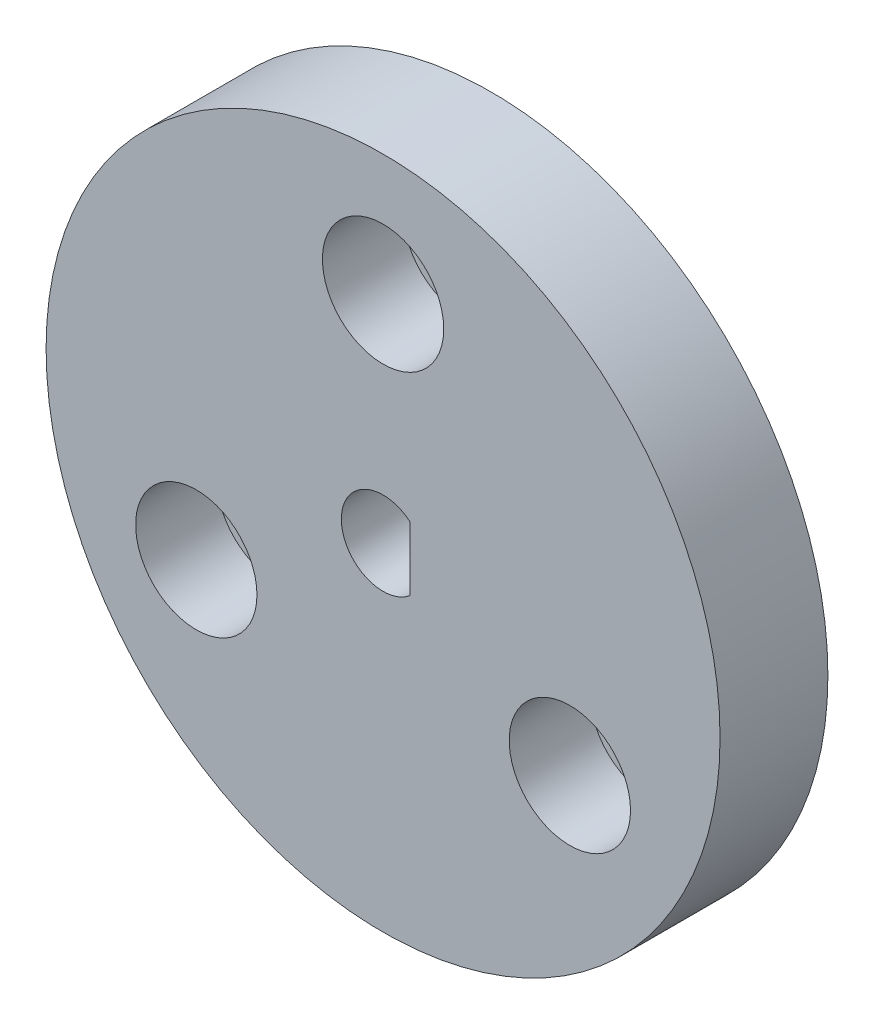
ISO-10303-21;
HEADER;
FILE_DESCRIPTION(('STEP AP214'),'2;1');
FILE_NAME('part.step','',(''),(''),'','','');
FILE_SCHEMA(('AUTOMOTIVE_DESIGN { 1 0 10303 214 1 1 1 1 }'));
ENDSEC;
DATA;
#1=APPLICATION_CONTEXT('core data for automotive mechanical design processes');
#2=APPLICATION_PROTOCOL_DEFINITION('international standard','automotive_design',2000,#1);
#3=PRODUCT_CONTEXT('',#1,'mechanical');
#4=PRODUCT('Part','Part','',(#3));
#5=PRODUCT_RELATED_PRODUCT_CATEGORY('part','',(#4));
#6=PRODUCT_DEFINITION_FORMATION('','',#4);
#7=PRODUCT_DEFINITION_CONTEXT('part definition',#1,'design');
#8=PRODUCT_DEFINITION('design','',#6,#7);
#9=PRODUCT_DEFINITION_SHAPE('','',#8);
#10=(LENGTH_UNIT() NAMED_UNIT(*) SI_UNIT(.MILLI.,.METRE.));
#11=(NAMED_UNIT(*) PLANE_ANGLE_UNIT() SI_UNIT($,.RADIAN.));
#12=(NAMED_UNIT(*) SI_UNIT($,.STERADIAN.) SOLID_ANGLE_UNIT());
#13=UNCERTAINTY_MEASURE_WITH_UNIT(LENGTH_MEASURE(1.E-05),#10,'distance_accuracy_value','');
#14=(GEOMETRIC_REPRESENTATION_CONTEXT(3) GLOBAL_UNCERTAINTY_ASSIGNED_CONTEXT((#13)) GLOBAL_UNIT_ASSIGNED_CONTEXT((#10,
#11,#12)) REPRESENTATION_CONTEXT('',''));
#15=CARTESIAN_POINT('',(0.,0.,0.));
#16=DIRECTION('',(0.,0.,1.));
#17=DIRECTION('',(1.,0.,0.));
#18=AXIS2_PLACEMENT_3D('',#15,#16,#17);
#19=CARTESIAN_POINT('',(-6.92820323027551,-4.,4.));
#20=DIRECTION('',(0.,0.,-1.));
#21=DIRECTION('',(-1.,0.,0.));
#22=AXIS2_PLACEMENT_3D('',#19,#20,#21);
#23=CYLINDRICAL_SURFACE('',#22,1.5);
#24=CARTESIAN_POINT('',(-6.92820323027551,-4.,0.));
#25=DIRECTION('',(0.,0.,1.));
#26=DIRECTION('',(1.,0.,0.));
#27=AXIS2_PLACEMENT_3D('',#24,#25,#26);
#28=CIRCLE('',#27,1.5);
#29=CARTESIAN_POINT('',(-5.42820323027551,-4.,0.));
#30=VERTEX_POINT('',#29);
#31=EDGE_CURVE('E140',#30,#30,#28,.T.);
#32=ORIENTED_EDGE('',*,*,#31,.F.);
#33=EDGE_LOOP('',(#32));
#34=FACE_BOUND('',#33,.T.);
#35=CARTESIAN_POINT('',(-6.92820323027551,-4.,1.));
#36=DIRECTION('',(0.,0.,1.));
#37=DIRECTION('',(1.,0.,0.));
#38=AXIS2_PLACEMENT_3D('',#35,#36,#37);
#39=CIRCLE('',#38,1.5);
#40=CARTESIAN_POINT('',(-5.42820323027551,-4.,1.));
#41=VERTEX_POINT('',#40);
#42=EDGE_CURVE('E71',#41,#41,#39,.T.);
#43=ORIENTED_EDGE('',*,*,#42,.T.);
#44=EDGE_LOOP('',(#43));
#45=FACE_BOUND('',#44,.T.);
#46=ADVANCED_FACE('F67',(#34,#45),#23,.F.);
#47=CARTESIAN_POINT('',(6.92820323027551,-4.,4.));
#48=DIRECTION('',(0.,0.,-1.));
#49=DIRECTION('',(-1.,0.,0.));
#50=AXIS2_PLACEMENT_3D('',#47,#48,#49);
#51=CYLINDRICAL_SURFACE('',#50,1.5);
#52=CARTESIAN_POINT('',(6.92820323027551,-4.,0.));
#53=DIRECTION('',(0.,0.,1.));
#54=DIRECTION('',(1.,0.,0.));
#55=AXIS2_PLACEMENT_3D('',#52,#53,#54);
#56=CIRCLE('',#55,1.5);
#57=CARTESIAN_POINT('',(8.42820323027551,-4.,0.));
#58=VERTEX_POINT('',#57);
#59=EDGE_CURVE('E137',#58,#58,#56,.T.);
#60=ORIENTED_EDGE('',*,*,#59,.F.);
#61=EDGE_LOOP('',(#60));
#62=FACE_BOUND('',#61,.T.);
#63=CARTESIAN_POINT('',(6.92820323027551,-4.,1.));
#64=DIRECTION('',(0.,0.,1.));
#65=DIRECTION('',(1.,0.,0.));
#66=AXIS2_PLACEMENT_3D('',#63,#64,#65);
#67=CIRCLE('',#66,1.5);
#68=CARTESIAN_POINT('',(8.42820323027551,-4.,1.));
#69=VERTEX_POINT('',#68);
#70=EDGE_CURVE('E146',#69,#69,#67,.T.);
#71=ORIENTED_EDGE('',*,*,#70,.T.);
#72=EDGE_LOOP('',(#71));
#73=FACE_BOUND('',#72,.T.);
#74=ADVANCED_FACE('F189',(#62,#73),#51,.F.);
#75=CARTESIAN_POINT('',(0.,8.,4.));
#76=DIRECTION('',(0.,0.,-1.));
#77=DIRECTION('',(-1.,0.,0.));
#78=AXIS2_PLACEMENT_3D('',#75,#76,#77);
#79=CYLINDRICAL_SURFACE('',#78,1.5);
#80=CARTESIAN_POINT('',(0.,8.,0.));
#81=DIRECTION('',(0.,0.,1.));
#82=DIRECTION('',(1.,0.,0.));
#83=AXIS2_PLACEMENT_3D('',#80,#81,#82);
#84=CIRCLE('',#83,1.5);
#85=CARTESIAN_POINT('',(1.5,8.,0.));
#86=VERTEX_POINT('',#85);
#87=EDGE_CURVE('E134',#86,#86,#84,.T.);
#88=ORIENTED_EDGE('',*,*,#87,.F.);
#89=EDGE_LOOP('',(#88));
#90=FACE_BOUND('',#89,.T.);
#91=CARTESIAN_POINT('',(0.,8.,1.));
#92=DIRECTION('',(0.,0.,1.));
#93=DIRECTION('',(1.,0.,0.));
#94=AXIS2_PLACEMENT_3D('',#91,#92,#93);
#95=CIRCLE('',#94,1.5);
#96=CARTESIAN_POINT('',(1.5,8.,1.));
#97=VERTEX_POINT('',#96);
#98=EDGE_CURVE('E123',#97,#97,#95,.T.);
#99=ORIENTED_EDGE('',*,*,#98,.T.);
#100=EDGE_LOOP('',(#99));
#101=FACE_BOUND('',#100,.T.);
#102=ADVANCED_FACE('F179',(#90,#101),#79,.F.);
#103=CARTESIAN_POINT('',(0.,0.,0.));
#104=DIRECTION('',(0.,0.,1.));
#105=DIRECTION('',(1.,0.,0.));
#106=AXIS2_PLACEMENT_3D('',#103,#104,#105);
#107=PLANE('',#106);
#108=CARTESIAN_POINT('',(0.,0.,0.));
#109=DIRECTION('',(0.,0.,1.));
#110=DIRECTION('',(1.,0.,0.));
#111=AXIS2_PLACEMENT_3D('',#108,#109,#110);
#112=CIRCLE('',#111,1.55);
#113=CARTESIAN_POINT('',(1.00000000000004,1.18427192823264,0.));
#114=VERTEX_POINT('',#113);
#115=CARTESIAN_POINT('',(0.999999999999995,-1.18427192823271,0.));
#116=VERTEX_POINT('',#115);
#117=EDGE_CURVE('E112',#114,#116,#112,.T.);
#118=ORIENTED_EDGE('',*,*,#117,.T.);
#119=DIRECTION('',(0.,1.,0.));
#120=VECTOR('',#119,1.);
#121=CARTESIAN_POINT('',(1.,0.,0.));
#122=LINE('',#121,#120);
#123=EDGE_CURVE('E84',#116,#114,#122,.T.);
#124=ORIENTED_EDGE('',*,*,#123,.T.);
#125=EDGE_LOOP('',(#118,#124));
#126=FACE_BOUND('',#125,.T.);
#127=CARTESIAN_POINT('',(0.,0.,0.));
#128=DIRECTION('',(0.,0.,1.));
#129=DIRECTION('',(1.,0.,0.));
#130=AXIS2_PLACEMENT_3D('',#127,#128,#129);
#131=CIRCLE('',#130,12.5);
#132=CARTESIAN_POINT('',(12.5,0.,0.));
#133=VERTEX_POINT('',#132);
#134=EDGE_CURVE('E76',#133,#133,#131,.T.);
#135=ORIENTED_EDGE('',*,*,#134,.F.);
#136=EDGE_LOOP('',(#135));
#137=FACE_BOUND('',#136,.T.);
#138=ORIENTED_EDGE('',*,*,#31,.T.);
#139=EDGE_LOOP('',(#138));
#140=FACE_BOUND('',#139,.T.);
#141=ORIENTED_EDGE('',*,*,#59,.T.);
#142=EDGE_LOOP('',(#141));
#143=FACE_BOUND('',#142,.T.);
#144=ORIENTED_EDGE('',*,*,#87,.T.);
#145=EDGE_LOOP('',(#144));
#146=FACE_BOUND('',#145,.T.);
#147=ADVANCED_FACE('F69',(#126,#137,#140,#143,#146),#107,.F.);
#148=CARTESIAN_POINT('',(0.,0.,4.));
#149=DIRECTION('',(0.,0.,-1.));
#150=DIRECTION('',(-1.,0.,0.));
#151=AXIS2_PLACEMENT_3D('',#148,#149,#150);
#152=CYLINDRICAL_SURFACE('',#151,12.5);
#153=CARTESIAN_POINT('',(0.,0.,4.));
#154=DIRECTION('',(0.,0.,1.));
#155=DIRECTION('',(1.,0.,0.));
#156=AXIS2_PLACEMENT_3D('',#153,#154,#155);
#157=CIRCLE('',#156,12.5);
#158=CARTESIAN_POINT('',(12.5,0.,4.));
#159=VERTEX_POINT('',#158);
#160=EDGE_CURVE('E13',#159,#159,#157,.T.);
#161=ORIENTED_EDGE('',*,*,#160,.F.);
#162=EDGE_LOOP('',(#161));
#163=FACE_BOUND('',#162,.T.);
#164=ORIENTED_EDGE('',*,*,#134,.T.);
#165=EDGE_LOOP('',(#164));
#166=FACE_BOUND('',#165,.T.);
#167=ADVANCED_FACE('F169',(#163,#166),#152,.T.);
#168=CARTESIAN_POINT('',(0.,0.,4.));
#169=DIRECTION('',(0.,0.,1.));
#170=DIRECTION('',(1.,0.,0.));
#171=AXIS2_PLACEMENT_3D('',#168,#169,#170);
#172=PLANE('',#171);
#173=DIRECTION('',(0.,1.,0.));
#174=VECTOR('',#173,1.);
#175=CARTESIAN_POINT('',(1.,0.,4.));
#176=LINE('',#175,#174);
#177=CARTESIAN_POINT('',(1.,-1.18427192823271,4.));
#178=VERTEX_POINT('',#177);
#179=CARTESIAN_POINT('',(1.00000000000005,1.18427192823266,4.));
#180=VERTEX_POINT('',#179);
#181=EDGE_CURVE('E89',#178,#180,#176,.T.);
#182=ORIENTED_EDGE('',*,*,#181,.F.);
#183=CARTESIAN_POINT('',(0.,0.,4.));
#184=DIRECTION('',(0.,0.,1.));
#185=DIRECTION('',(1.,0.,0.));
#186=AXIS2_PLACEMENT_3D('',#183,#184,#185);
#187=CIRCLE('',#186,1.55);
#188=EDGE_CURVE('E104',#180,#178,#187,.T.);
#189=ORIENTED_EDGE('',*,*,#188,.F.);
#190=EDGE_LOOP('',(#182,#189));
#191=FACE_BOUND('',#190,.T.);
#192=CARTESIAN_POINT('',(0.,8.,4.));
#193=DIRECTION('',(0.,0.,1.));
#194=DIRECTION('',(1.,0.,0.));
#195=AXIS2_PLACEMENT_3D('',#192,#193,#194);
#196=CIRCLE('',#195,2.25);
#197=CARTESIAN_POINT('',(2.25,8.,4.));
#198=VERTEX_POINT('',#197);
#199=EDGE_CURVE('E116',#198,#198,#196,.T.);
#200=ORIENTED_EDGE('',*,*,#199,.F.);
#201=EDGE_LOOP('',(#200));
#202=FACE_BOUND('',#201,.T.);
#203=CARTESIAN_POINT('',(6.92820323027551,-4.,4.));
#204=DIRECTION('',(0.,0.,1.));
#205=DIRECTION('',(1.,0.,0.));
#206=AXIS2_PLACEMENT_3D('',#203,#204,#205);
#207=CIRCLE('',#206,2.25);
#208=CARTESIAN_POINT('',(9.17820323027551,-4.,4.));
#209=VERTEX_POINT('',#208);
#210=EDGE_CURVE('E120',#209,#209,#207,.T.);
#211=ORIENTED_EDGE('',*,*,#210,.F.);
#212=EDGE_LOOP('',(#211));
#213=FACE_BOUND('',#212,.T.);
#214=CARTESIAN_POINT('',(-6.92820323027551,-4.,4.));
#215=DIRECTION('',(0.,0.,1.));
#216=DIRECTION('',(1.,0.,0.));
#217=AXIS2_PLACEMENT_3D('',#214,#215,#216);
#218=CIRCLE('',#217,2.25);
#219=CARTESIAN_POINT('',(-4.67820323027551,-4.,4.));
#220=VERTEX_POINT('',#219);
#221=EDGE_CURVE('E127',#220,#220,#218,.T.);
#222=ORIENTED_EDGE('',*,*,#221,.F.);
#223=EDGE_LOOP('',(#222));
#224=FACE_BOUND('',#223,.T.);
#225=ORIENTED_EDGE('',*,*,#160,.T.);
#226=EDGE_LOOP('',(#225));
#227=FACE_BOUND('',#226,.T.);
#228=ADVANCED_FACE('F108',(#191,#202,#213,#224,#227),#172,.T.);
#229=CARTESIAN_POINT('',(-6.92820323027551,-4.,-6.36396103067893));
#230=DIRECTION('',(0.,0.,1.));
#231=DIRECTION('',(1.,0.,0.));
#232=AXIS2_PLACEMENT_3D('',#229,#230,#231);
#233=CYLINDRICAL_SURFACE('',#232,2.25);
#234=CARTESIAN_POINT('',(-6.92820323027551,-4.,1.));
#235=DIRECTION('',(0.,0.,1.));
#236=DIRECTION('',(1.,0.,0.));
#237=AXIS2_PLACEMENT_3D('',#234,#235,#236);
#238=CIRCLE('',#237,2.25);
#239=CARTESIAN_POINT('',(-4.67820323027551,-4.,1.));
#240=VERTEX_POINT('',#239);
#241=EDGE_CURVE('E100',#240,#240,#238,.F.);
#242=CARTESIAN_POINT('',(-4.67820323027551,-4.,1.));
#243=CARTESIAN_POINT('',(-4.67820323027551,-4.,1.03125));
#244=CARTESIAN_POINT('',(-4.67820323027551,-4.,1.0625));
#245=CARTESIAN_POINT('',(-4.67820323027551,-4.,1.125));
#246=CARTESIAN_POINT('',(-4.67820323027551,-4.,1.15625));
#247=CARTESIAN_POINT('',(-4.67820323027551,-4.,1.21875));
#248=CARTESIAN_POINT('',(-4.67820323027551,-4.,1.25));
#249=CARTESIAN_POINT('',(-4.67820323027551,-4.,1.3125));
#250=CARTESIAN_POINT('',(-4.67820323027551,-4.,1.34375));
#251=CARTESIAN_POINT('',(-4.67820323027551,-4.,1.40625));
#252=CARTESIAN_POINT('',(-4.67820323027551,-4.,1.4375));
#253=CARTESIAN_POINT('',(-4.67820323027551,-4.,1.5));
#254=CARTESIAN_POINT('',(-4.67820323027551,-4.,1.53125));
#255=CARTESIAN_POINT('',(-4.67820323027551,-4.,1.59375));
#256=CARTESIAN_POINT('',(-4.67820323027551,-4.,1.625));
#257=CARTESIAN_POINT('',(-4.67820323027551,-4.,1.6875));
#258=CARTESIAN_POINT('',(-4.67820323027551,-4.,1.71875));
#259=CARTESIAN_POINT('',(-4.67820323027551,-4.,1.78125));
#260=CARTESIAN_POINT('',(-4.67820323027551,-4.,1.8125));
#261=CARTESIAN_POINT('',(-4.67820323027551,-4.,1.875));
#262=CARTESIAN_POINT('',(-4.67820323027551,-4.,1.90625));
#263=CARTESIAN_POINT('',(-4.67820323027551,-4.,1.96875));
#264=CARTESIAN_POINT('',(-4.67820323027551,-4.,2.));
#265=CARTESIAN_POINT('',(-4.67820323027551,-4.,2.0625));
#266=CARTESIAN_POINT('',(-4.67820323027551,-4.,2.09375));
#267=CARTESIAN_POINT('',(-4.67820323027551,-4.,2.15625));
#268=CARTESIAN_POINT('',(-4.67820323027551,-4.,2.1875));
#269=CARTESIAN_POINT('',(-4.67820323027551,-4.,2.25));
#270=CARTESIAN_POINT('',(-4.67820323027551,-4.,2.28125));
#271=CARTESIAN_POINT('',(-4.67820323027551,-4.,2.34375));
#272=CARTESIAN_POINT('',(-4.67820323027551,-4.,2.375));
#273=CARTESIAN_POINT('',(-4.67820323027551,-4.,2.4375));
#274=CARTESIAN_POINT('',(-4.67820323027551,-4.,2.46875));
#275=CARTESIAN_POINT('',(-4.67820323027551,-4.,2.53125));
#276=CARTESIAN_POINT('',(-4.67820323027551,-4.,2.5625));
#277=CARTESIAN_POINT('',(-4.67820323027551,-4.,2.625));
#278=CARTESIAN_POINT('',(-4.67820323027551,-4.,2.65625));
#279=CARTESIAN_POINT('',(-4.67820323027551,-4.,2.71875));
#280=CARTESIAN_POINT('',(-4.67820323027551,-4.,2.75));
#281=CARTESIAN_POINT('',(-4.67820323027551,-4.,2.8125));
#282=CARTESIAN_POINT('',(-4.67820323027551,-4.,2.84375));
#283=CARTESIAN_POINT('',(-4.67820323027551,-4.,2.90625));
#284=CARTESIAN_POINT('',(-4.67820323027551,-4.,2.9375));
#285=CARTESIAN_POINT('',(-4.67820323027551,-4.,3.));
#286=CARTESIAN_POINT('',(-4.67820323027551,-4.,3.03125));
#287=CARTESIAN_POINT('',(-4.67820323027551,-4.,3.09375));
#288=CARTESIAN_POINT('',(-4.67820323027551,-4.,3.125));
#289=CARTESIAN_POINT('',(-4.67820323027551,-4.,3.1875));
#290=CARTESIAN_POINT('',(-4.67820323027551,-4.,3.21875));
#291=CARTESIAN_POINT('',(-4.67820323027551,-4.,3.28125));
#292=CARTESIAN_POINT('',(-4.67820323027551,-4.,3.3125));
#293=CARTESIAN_POINT('',(-4.67820323027551,-4.,3.375));
#294=CARTESIAN_POINT('',(-4.67820323027551,-4.,3.40625));
#295=CARTESIAN_POINT('',(-4.67820323027551,-4.,3.46875));
#296=CARTESIAN_POINT('',(-4.67820323027551,-4.,3.5));
#297=CARTESIAN_POINT('',(-4.67820323027551,-4.,3.5625));
#298=CARTESIAN_POINT('',(-4.67820323027551,-4.,3.59375));
#299=CARTESIAN_POINT('',(-4.67820323027551,-4.,3.65625));
#300=CARTESIAN_POINT('',(-4.67820323027551,-4.,3.6875));
#301=CARTESIAN_POINT('',(-4.67820323027551,-4.,3.75));
#302=CARTESIAN_POINT('',(-4.67820323027551,-4.,3.78125));
#303=CARTESIAN_POINT('',(-4.67820323027551,-4.,3.84375));
#304=CARTESIAN_POINT('',(-4.67820323027551,-4.,3.875));
#305=CARTESIAN_POINT('',(-4.67820323027551,-4.,3.9375));
#306=CARTESIAN_POINT('',(-4.67820323027551,-4.,3.96875));
#307=CARTESIAN_POINT('',(-4.67820323027551,-4.,4.));
#308=B_SPLINE_CURVE_WITH_KNOTS('',3,(#242,#243,#244,#245,#246,#247,#248,#249,#250,#251,#252,
#253,#254,#255,#256,#257,#258,#259,#260,#261,#262,#263,#264,#265,#266,#267,#268,#269,#270,#271,
#272,#273,#274,#275,#276,#277,#278,#279,#280,#281,#282,#283,#284,#285,#286,#287,#288,#289,#290,
#291,#292,#293,#294,#295,#296,#297,#298,#299,#300,#301,#302,#303,#304,#305,#306,#307),
.UNSPECIFIED.,.F.,.F.,(4,2,2,2,2,2,2,2,2,2,2,2,2,2,2,2,2,2,2,2,2,2,2,2,2,2,2,2,2,2,2,2,4),(0.,
0.0937500000000001,0.1875,0.28125,0.375,0.46875,0.5625,0.65625,0.75,0.843749999999998,
0.937499999999998,1.03125,1.125,1.21875,1.3125,1.40625,1.5,1.59375,1.6875,1.78125,1.875,1.96875,
2.0625,2.15625,2.25,2.34375,2.4375,2.53125,2.625,2.71875,2.8125,2.90625,3.),.UNSPECIFIED.);
#309=EDGE_CURVE('BSEAM158',#240,#220,#308,.T.);
#310=ORIENTED_EDGE('',*,*,#241,.T.);
#311=ORIENTED_EDGE('',*,*,#221,.T.);
#312=ORIENTED_EDGE('',*,*,#309,.T.);
#313=ORIENTED_EDGE('',*,*,#309,.F.);
#314=EDGE_LOOP('',(#310,#312,#311,#313));
#315=FACE_BOUND('',#314,.T.);
#316=ADVANCED_FACE('F158',(#315),#233,.F.);
#317=CARTESIAN_POINT('',(0.,0.,1.));
#318=DIRECTION('',(0.,0.,1.));
#319=DIRECTION('',(1.,0.,0.));
#320=AXIS2_PLACEMENT_3D('',#317,#318,#319);
#321=PLANE('',#320);
#322=ORIENTED_EDGE('',*,*,#42,.F.);
#323=EDGE_LOOP('',(#322));
#324=FACE_BOUND('',#323,.T.);
#325=ORIENTED_EDGE('',*,*,#241,.F.);
#326=EDGE_LOOP('',(#325));
#327=FACE_BOUND('',#326,.T.);
#328=ADVANCED_FACE('F154',(#324,#327),#321,.T.);
#329=CARTESIAN_POINT('',(6.92820323027551,-4.,-6.36396103067893));
#330=DIRECTION('',(0.,0.,1.));
#331=DIRECTION('',(1.,0.,0.));
#332=AXIS2_PLACEMENT_3D('',#329,#330,#331);
#333=CYLINDRICAL_SURFACE('',#332,2.25);
#334=CARTESIAN_POINT('',(6.92820323027551,-4.,1.));
#335=DIRECTION('',(0.,0.,1.));
#336=DIRECTION('',(1.,0.,0.));
#337=AXIS2_PLACEMENT_3D('',#334,#335,#336);
#338=CIRCLE('',#337,2.25);
#339=CARTESIAN_POINT('',(9.17820323027551,-4.,1.));
#340=VERTEX_POINT('',#339);
#341=EDGE_CURVE('E124',#340,#340,#338,.F.);
#342=CARTESIAN_POINT('',(9.17820323027551,-4.,1.));
#343=CARTESIAN_POINT('',(9.17820323027551,-4.,1.03125));
#344=CARTESIAN_POINT('',(9.17820323027551,-4.,1.0625));
#345=CARTESIAN_POINT('',(9.17820323027551,-4.,1.125));
#346=CARTESIAN_POINT('',(9.17820323027551,-4.,1.15625));
#347=CARTESIAN_POINT('',(9.17820323027551,-4.,1.21875));
#348=CARTESIAN_POINT('',(9.17820323027551,-4.,1.25));
#349=CARTESIAN_POINT('',(9.17820323027551,-4.,1.3125));
#350=CARTESIAN_POINT('',(9.17820323027551,-4.,1.34375));
#351=CARTESIAN_POINT('',(9.17820323027551,-4.,1.40625));
#352=CARTESIAN_POINT('',(9.17820323027551,-4.,1.4375));
#353=CARTESIAN_POINT('',(9.17820323027551,-4.,1.5));
#354=CARTESIAN_POINT('',(9.17820323027551,-4.,1.53125));
#355=CARTESIAN_POINT('',(9.17820323027551,-4.,1.59375));
#356=CARTESIAN_POINT('',(9.17820323027551,-4.,1.625));
#357=CARTESIAN_POINT('',(9.17820323027551,-4.,1.6875));
#358=CARTESIAN_POINT('',(9.17820323027551,-4.,1.71875));
#359=CARTESIAN_POINT('',(9.17820323027551,-4.,1.78125));
#360=CARTESIAN_POINT('',(9.17820323027551,-4.,1.8125));
#361=CARTESIAN_POINT('',(9.17820323027551,-4.,1.875));
#362=CARTESIAN_POINT('',(9.17820323027551,-4.,1.90625));
#363=CARTESIAN_POINT('',(9.17820323027551,-4.,1.96875));
#364=CARTESIAN_POINT('',(9.17820323027551,-4.,2.));
#365=CARTESIAN_POINT('',(9.17820323027551,-4.,2.0625));
#366=CARTESIAN_POINT('',(9.17820323027551,-4.,2.09375));
#367=CARTESIAN_POINT('',(9.17820323027551,-4.,2.15625));
#368=CARTESIAN_POINT('',(9.17820323027551,-4.,2.1875));
#369=CARTESIAN_POINT('',(9.17820323027551,-4.,2.25));
#370=CARTESIAN_POINT('',(9.17820323027551,-4.,2.28125));
#371=CARTESIAN_POINT('',(9.17820323027551,-4.,2.34375));
#372=CARTESIAN_POINT('',(9.17820323027551,-4.,2.375));
#373=CARTESIAN_POINT('',(9.17820323027551,-4.,2.4375));
#374=CARTESIAN_POINT('',(9.17820323027551,-4.,2.46875));
#375=CARTESIAN_POINT('',(9.17820323027551,-4.,2.53125));
#376=CARTESIAN_POINT('',(9.17820323027551,-4.,2.5625));
#377=CARTESIAN_POINT('',(9.17820323027551,-4.,2.625));
#378=CARTESIAN_POINT('',(9.17820323027551,-4.,2.65625));
#379=CARTESIAN_POINT('',(9.17820323027551,-4.,2.71875));
#380=CARTESIAN_POINT('',(9.17820323027551,-4.,2.75));
#381=CARTESIAN_POINT('',(9.17820323027551,-4.,2.8125));
#382=CARTESIAN_POINT('',(9.17820323027551,-4.,2.84375));
#383=CARTESIAN_POINT('',(9.17820323027551,-4.,2.90625));
#384=CARTESIAN_POINT('',(9.17820323027551,-4.,2.9375));
#385=CARTESIAN_POINT('',(9.17820323027551,-4.,3.));
#386=CARTESIAN_POINT('',(9.17820323027551,-4.,3.03125));
#387=CARTESIAN_POINT('',(9.17820323027551,-4.,3.09375));
#388=CARTESIAN_POINT('',(9.17820323027551,-4.,3.125));
#389=CARTESIAN_POINT('',(9.17820323027551,-4.,3.1875));
#390=CARTESIAN_POINT('',(9.17820323027551,-4.,3.21875));
#391=CARTESIAN_POINT('',(9.17820323027551,-4.,3.28125));
#392=CARTESIAN_POINT('',(9.17820323027551,-4.,3.3125));
#393=CARTESIAN_POINT('',(9.17820323027551,-4.,3.375));
#394=CARTESIAN_POINT('',(9.17820323027551,-4.,3.40625));
#395=CARTESIAN_POINT('',(9.17820323027551,-4.,3.46875));
#396=CARTESIAN_POINT('',(9.17820323027551,-4.,3.5));
#397=CARTESIAN_POINT('',(9.17820323027551,-4.,3.5625));
#398=CARTESIAN_POINT('',(9.17820323027551,-4.,3.59375));
#399=CARTESIAN_POINT('',(9.17820323027551,-4.,3.65625));
#400=CARTESIAN_POINT('',(9.17820323027551,-4.,3.6875));
#401=CARTESIAN_POINT('',(9.17820323027551,-4.,3.75));
#402=CARTESIAN_POINT('',(9.17820323027551,-4.,3.78125));
#403=CARTESIAN_POINT('',(9.17820323027551,-4.,3.84375));
#404=CARTESIAN_POINT('',(9.17820323027551,-4.,3.875));
#405=CARTESIAN_POINT('',(9.17820323027551,-4.,3.9375));
#406=CARTESIAN_POINT('',(9.17820323027551,-4.,3.96875));
#407=CARTESIAN_POINT('',(9.17820323027551,-4.,4.));
#408=B_SPLINE_CURVE_WITH_KNOTS('',3,(#342,#343,#344,#345,#346,#347,#348,#349,#350,#351,#352,
#353,#354,#355,#356,#357,#358,#359,#360,#361,#362,#363,#364,#365,#366,#367,#368,#369,#370,#371,
#372,#373,#374,#375,#376,#377,#378,#379,#380,#381,#382,#383,#384,#385,#386,#387,#388,#389,#390,
#391,#392,#393,#394,#395,#396,#397,#398,#399,#400,#401,#402,#403,#404,#405,#406,#407),
.UNSPECIFIED.,.F.,.F.,(4,2,2,2,2,2,2,2,2,2,2,2,2,2,2,2,2,2,2,2,2,2,2,2,2,2,2,2,2,2,2,2,4),(0.,
0.0937500000000001,0.1875,0.28125,0.375,0.46875,0.5625,0.65625,0.75,0.843749999999998,
0.937499999999998,1.03125,1.125,1.21875,1.3125,1.40625,1.5,1.59375,1.6875,1.78125,1.875,1.96875,
2.0625,2.15625,2.25,2.34375,2.4375,2.53125,2.625,2.71875,2.8125,2.90625,3.),.UNSPECIFIED.);
#409=EDGE_CURVE('BSEAM157',#340,#209,#408,.T.);
#410=ORIENTED_EDGE('',*,*,#341,.T.);
#411=ORIENTED_EDGE('',*,*,#210,.T.);
#412=ORIENTED_EDGE('',*,*,#409,.T.);
#413=ORIENTED_EDGE('',*,*,#409,.F.);
#414=EDGE_LOOP('',(#410,#412,#411,#413));
#415=FACE_BOUND('',#414,.T.);
#416=ADVANCED_FACE('F157',(#415),#333,.F.);
#417=CARTESIAN_POINT('',(0.,0.,1.));
#418=DIRECTION('',(0.,0.,1.));
#419=DIRECTION('',(1.,0.,0.));
#420=AXIS2_PLACEMENT_3D('',#417,#418,#419);
#421=PLANE('',#420);
#422=ORIENTED_EDGE('',*,*,#70,.F.);
#423=EDGE_LOOP('',(#422));
#424=FACE_BOUND('',#423,.T.);
#425=ORIENTED_EDGE('',*,*,#341,.F.);
#426=EDGE_LOOP('',(#425));
#427=FACE_BOUND('',#426,.T.);
#428=ADVANCED_FACE('F202',(#424,#427),#421,.T.);
#429=CARTESIAN_POINT('',(0.,8.,-6.36396103067893));
#430=DIRECTION('',(0.,0.,1.));
#431=DIRECTION('',(1.,0.,0.));
#432=AXIS2_PLACEMENT_3D('',#429,#430,#431);
#433=CYLINDRICAL_SURFACE('',#432,2.25);
#434=CARTESIAN_POINT('',(0.,8.,1.));
#435=DIRECTION('',(0.,0.,1.));
#436=DIRECTION('',(1.,0.,0.));
#437=AXIS2_PLACEMENT_3D('',#434,#435,#436);
#438=CIRCLE('',#437,2.25);
#439=CARTESIAN_POINT('',(2.25,8.,1.));
#440=VERTEX_POINT('',#439);
#441=EDGE_CURVE('E119',#440,#440,#438,.F.);
#442=CARTESIAN_POINT('',(2.25,8.,1.));
#443=CARTESIAN_POINT('',(2.25,8.,1.03125));
#444=CARTESIAN_POINT('',(2.25,8.,1.0625));
#445=CARTESIAN_POINT('',(2.25,8.,1.125));
#446=CARTESIAN_POINT('',(2.25,8.,1.15625));
#447=CARTESIAN_POINT('',(2.25,8.,1.21875));
#448=CARTESIAN_POINT('',(2.25,8.,1.25));
#449=CARTESIAN_POINT('',(2.25,8.,1.3125));
#450=CARTESIAN_POINT('',(2.25,8.,1.34375));
#451=CARTESIAN_POINT('',(2.25,8.,1.40625));
#452=CARTESIAN_POINT('',(2.25,8.,1.4375));
#453=CARTESIAN_POINT('',(2.25,8.,1.5));
#454=CARTESIAN_POINT('',(2.25,8.,1.53125));
#455=CARTESIAN_POINT('',(2.25,8.,1.59375));
#456=CARTESIAN_POINT('',(2.25,8.,1.625));
#457=CARTESIAN_POINT('',(2.25,8.,1.6875));
#458=CARTESIAN_POINT('',(2.25,8.,1.71875));
#459=CARTESIAN_POINT('',(2.25,8.,1.78125));
#460=CARTESIAN_POINT('',(2.25,8.,1.8125));
#461=CARTESIAN_POINT('',(2.25,8.,1.875));
#462=CARTESIAN_POINT('',(2.25,8.,1.90625));
#463=CARTESIAN_POINT('',(2.25,8.,1.96875));
#464=CARTESIAN_POINT('',(2.25,8.,2.));
#465=CARTESIAN_POINT('',(2.25,8.,2.0625));
#466=CARTESIAN_POINT('',(2.25,8.,2.09375));
#467=CARTESIAN_POINT('',(2.25,8.,2.15625));
#468=CARTESIAN_POINT('',(2.25,8.,2.1875));
#469=CARTESIAN_POINT('',(2.25,8.,2.25));
#470=CARTESIAN_POINT('',(2.25,8.,2.28125));
#471=CARTESIAN_POINT('',(2.25,8.,2.34375));
#472=CARTESIAN_POINT('',(2.25,8.,2.375));
#473=CARTESIAN_POINT('',(2.25,8.,2.4375));
#474=CARTESIAN_POINT('',(2.25,8.,2.46875));
#475=CARTESIAN_POINT('',(2.25,8.,2.53125));
#476=CARTESIAN_POINT('',(2.25,8.,2.5625));
#477=CARTESIAN_POINT('',(2.25,8.,2.625));
#478=CARTESIAN_POINT('',(2.25,8.,2.65625));
#479=CARTESIAN_POINT('',(2.25,8.,2.71875));
#480=CARTESIAN_POINT('',(2.25,8.,2.75));
#481=CARTESIAN_POINT('',(2.25,8.,2.8125));
#482=CARTESIAN_POINT('',(2.25,8.,2.84375));
#483=CARTESIAN_POINT('',(2.25,8.,2.90625));
#484=CARTESIAN_POINT('',(2.25,8.,2.9375));
#485=CARTESIAN_POINT('',(2.25,8.,3.));
#486=CARTESIAN_POINT('',(2.25,8.,3.03125));
#487=CARTESIAN_POINT('',(2.25,8.,3.09375));
#488=CARTESIAN_POINT('',(2.25,8.,3.125));
#489=CARTESIAN_POINT('',(2.25,8.,3.1875));
#490=CARTESIAN_POINT('',(2.25,8.,3.21875));
#491=CARTESIAN_POINT('',(2.25,8.,3.28125));
#492=CARTESIAN_POINT('',(2.25,8.,3.3125));
#493=CARTESIAN_POINT('',(2.25,8.,3.375));
#494=CARTESIAN_POINT('',(2.25,8.,3.40625));
#495=CARTESIAN_POINT('',(2.25,8.,3.46875));
#496=CARTESIAN_POINT('',(2.25,8.,3.5));
#497=CARTESIAN_POINT('',(2.25,8.,3.5625));
#498=CARTESIAN_POINT('',(2.25,8.,3.59375));
#499=CARTESIAN_POINT('',(2.25,8.,3.65625));
#500=CARTESIAN_POINT('',(2.25,8.,3.6875));
#501=CARTESIAN_POINT('',(2.25,8.,3.75));
#502=CARTESIAN_POINT('',(2.25,8.,3.78125));
#503=CARTESIAN_POINT('',(2.25,8.,3.84375));
#504=CARTESIAN_POINT('',(2.25,8.,3.875));
#505=CARTESIAN_POINT('',(2.25,8.,3.9375));
#506=CARTESIAN_POINT('',(2.25,8.,3.96875));
#507=CARTESIAN_POINT('',(2.25,8.,4.));
#508=B_SPLINE_CURVE_WITH_KNOTS('',3,(#442,#443,#444,#445,#446,#447,#448,#449,#450,#451,#452,
#453,#454,#455,#456,#457,#458,#459,#460,#461,#462,#463,#464,#465,#466,#467,#468,#469,#470,#471,
#472,#473,#474,#475,#476,#477,#478,#479,#480,#481,#482,#483,#484,#485,#486,#487,#488,#489,#490,
#491,#492,#493,#494,#495,#496,#497,#498,#499,#500,#501,#502,#503,#504,#505,#506,#507),
.UNSPECIFIED.,.F.,.F.,(4,2,2,2,2,2,2,2,2,2,2,2,2,2,2,2,2,2,2,2,2,2,2,2,2,2,2,2,2,2,2,2,4),(0.,
0.0937500000000001,0.1875,0.28125,0.375,0.46875,0.5625,0.65625,0.75,0.843749999999998,
0.937499999999998,1.03125,1.125,1.21875,1.3125,1.40625,1.5,1.59375,1.6875,1.78125,1.875,1.96875,
2.0625,2.15625,2.25,2.34375,2.4375,2.53125,2.625,2.71875,2.8125,2.90625,3.),.UNSPECIFIED.);
#509=EDGE_CURVE('BSEAM196',#440,#198,#508,.T.);
#510=ORIENTED_EDGE('',*,*,#441,.T.);
#511=ORIENTED_EDGE('',*,*,#199,.T.);
#512=ORIENTED_EDGE('',*,*,#509,.T.);
#513=ORIENTED_EDGE('',*,*,#509,.F.);
#514=EDGE_LOOP('',(#510,#512,#511,#513));
#515=FACE_BOUND('',#514,.T.);
#516=ADVANCED_FACE('F196',(#515),#433,.F.);
#517=CARTESIAN_POINT('',(0.,0.,1.));
#518=DIRECTION('',(0.,0.,1.));
#519=DIRECTION('',(1.,0.,0.));
#520=AXIS2_PLACEMENT_3D('',#517,#518,#519);
#521=PLANE('',#520);
#522=ORIENTED_EDGE('',*,*,#98,.F.);
#523=EDGE_LOOP('',(#522));
#524=FACE_BOUND('',#523,.T.);
#525=ORIENTED_EDGE('',*,*,#441,.F.);
#526=EDGE_LOOP('',(#525));
#527=FACE_BOUND('',#526,.T.);
#528=ADVANCED_FACE('F193',(#524,#527),#521,.T.);
#529=CARTESIAN_POINT('',(1.,0.,0.));
#530=DIRECTION('',(1.,0.,0.));
#531=DIRECTION('',(0.,1.,0.));
#532=AXIS2_PLACEMENT_3D('',#529,#530,#531);
#533=PLANE('',#532);
#534=ORIENTED_EDGE('',*,*,#181,.T.);
#535=DIRECTION('',(0.,0.,1.));
#536=VECTOR('',#535,1.);
#537=CARTESIAN_POINT('',(1.00000000000004,1.18427192823264,0.));
#538=LINE('',#537,#536);
#539=EDGE_CURVE('E101',#114,#180,#538,.T.);
#540=ORIENTED_EDGE('',*,*,#539,.F.);
#541=ORIENTED_EDGE('',*,*,#123,.F.);
#542=DIRECTION('',(0.,0.,1.));
#543=VECTOR('',#542,1.);
#544=CARTESIAN_POINT('',(1.,-1.18427192823271,0.));
#545=LINE('',#544,#543);
#546=EDGE_CURVE('E94',#116,#178,#545,.T.);
#547=ORIENTED_EDGE('',*,*,#546,.T.);
#548=EDGE_LOOP('',(#534,#540,#541,#547));
#549=FACE_BOUND('',#548,.T.);
#550=ADVANCED_FACE('F96',(#549),#533,.F.);
#551=CARTESIAN_POINT('',(0.,0.,0.));
#552=DIRECTION('',(0.,0.,1.));
#553=DIRECTION('',(1.,0.,0.));
#554=AXIS2_PLACEMENT_3D('',#551,#552,#553);
#555=CYLINDRICAL_SURFACE('',#554,1.55);
#556=ORIENTED_EDGE('',*,*,#188,.T.);
#557=ORIENTED_EDGE('',*,*,#546,.F.);
#558=ORIENTED_EDGE('',*,*,#117,.F.);
#559=ORIENTED_EDGE('',*,*,#539,.T.);
#560=EDGE_LOOP('',(#556,#557,#558,#559));
#561=FACE_BOUND('',#560,.T.);
#562=ADVANCED_FACE('F105',(#561),#555,.F.);
#563=CLOSED_SHELL('',(#46,#74,#102,#147,#167,#228,#316,#328,#416,#428,#516,#528,#550,#562));
#564=MANIFOLD_SOLID_BREP('B2',#563);
#565=ADVANCED_BREP_SHAPE_REPRESENTATION('',(#18,#564),#14);
#566=SHAPE_DEFINITION_REPRESENTATION(#9,#565);
ENDSEC;
END-ISO-10303-21;
